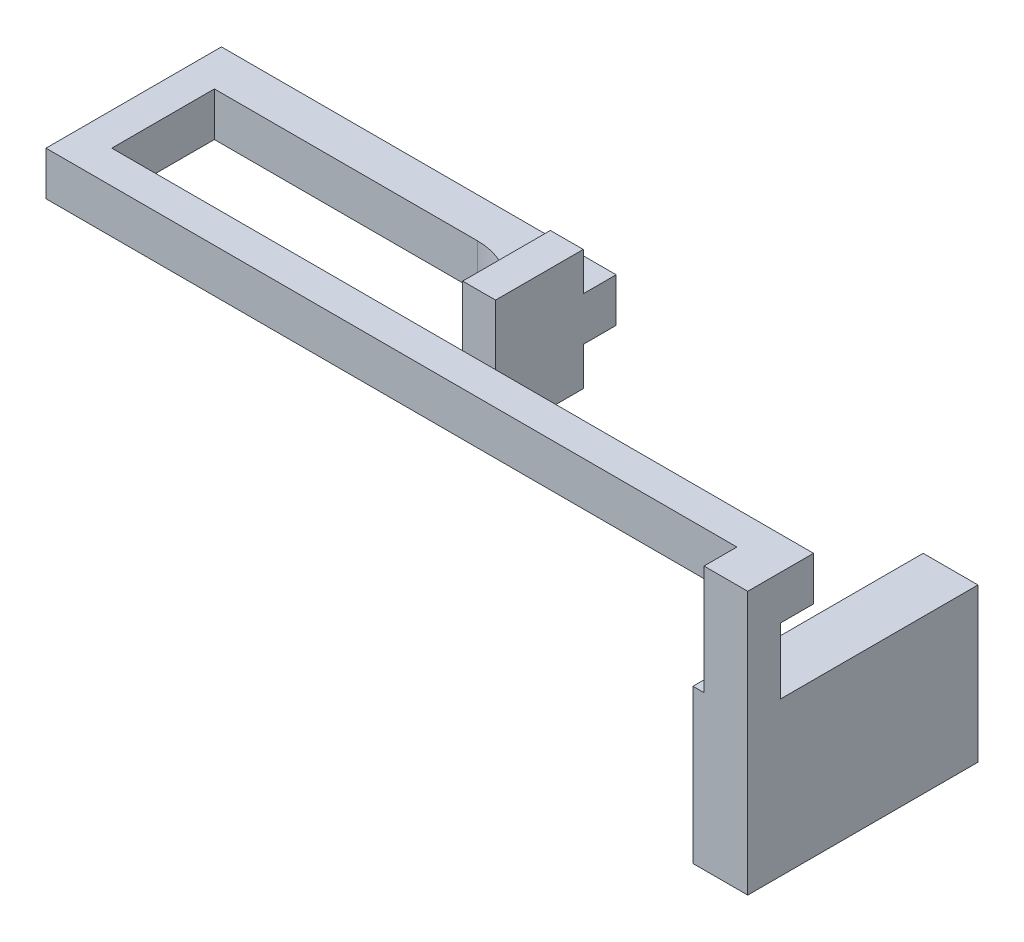
ISO-10303-21;
HEADER;
FILE_DESCRIPTION(('STEP AP214'),'2;1');
FILE_NAME('part.step','',(''),(''),'','','');
FILE_SCHEMA(('AUTOMOTIVE_DESIGN { 1 0 10303 214 1 1 1 1 }'));
ENDSEC;
DATA;
#1=APPLICATION_CONTEXT('core data for automotive mechanical design processes');
#2=APPLICATION_PROTOCOL_DEFINITION('international standard','automotive_design',2000,#1);
#3=PRODUCT_CONTEXT('',#1,'mechanical');
#4=PRODUCT('Part','Part','',(#3));
#5=PRODUCT_RELATED_PRODUCT_CATEGORY('part','',(#4));
#6=PRODUCT_DEFINITION_FORMATION('','',#4);
#7=PRODUCT_DEFINITION_CONTEXT('part definition',#1,'design');
#8=PRODUCT_DEFINITION('design','',#6,#7);
#9=PRODUCT_DEFINITION_SHAPE('','',#8);
#10=(LENGTH_UNIT() NAMED_UNIT(*) SI_UNIT(.MILLI.,.METRE.));
#11=(NAMED_UNIT(*) PLANE_ANGLE_UNIT() SI_UNIT($,.RADIAN.));
#12=(NAMED_UNIT(*) SI_UNIT($,.STERADIAN.) SOLID_ANGLE_UNIT());
#13=UNCERTAINTY_MEASURE_WITH_UNIT(LENGTH_MEASURE(1.E-05),#10,'distance_accuracy_value','');
#14=(GEOMETRIC_REPRESENTATION_CONTEXT(3) GLOBAL_UNCERTAINTY_ASSIGNED_CONTEXT((#13)) GLOBAL_UNIT_ASSIGNED_CONTEXT((#10,
#11,#12)) REPRESENTATION_CONTEXT('',''));
#15=CARTESIAN_POINT('',(0.,0.,0.));
#16=DIRECTION('',(0.,0.,1.));
#17=DIRECTION('',(1.,0.,0.));
#18=AXIS2_PLACEMENT_3D('',#15,#16,#17);
#19=CARTESIAN_POINT('',(-81.28,0.,0.));
#20=DIRECTION('',(1.,0.,0.));
#21=DIRECTION('',(0.,0.,-1.));
#22=AXIS2_PLACEMENT_3D('',#19,#20,#21);
#23=PLANE('',#22);
#24=DIRECTION('',(0.,0.,1.));
#25=VECTOR('',#24,1.);
#26=CARTESIAN_POINT('',(-81.28,0.,3.81));
#27=LINE('',#26,#25);
#28=CARTESIAN_POINT('',(-81.28,0.,-11.8836444934551));
#29=VERTEX_POINT('',#28);
#30=CARTESIAN_POINT('',(-81.28,0.,0.));
#31=VERTEX_POINT('',#30);
#32=EDGE_CURVE('E257',#29,#31,#27,.T.);
#33=ORIENTED_EDGE('',*,*,#32,.F.);
#34=DIRECTION('',(0.,-1.,0.));
#35=VECTOR('',#34,1.);
#36=CARTESIAN_POINT('',(-81.28,5.07999999999999,-11.8836444934551));
#37=LINE('',#36,#35);
#38=CARTESIAN_POINT('',(-81.28,5.07999999999999,-11.8836444934551));
#39=VERTEX_POINT('',#38);
#40=EDGE_CURVE('E241',#39,#29,#37,.T.);
#41=ORIENTED_EDGE('',*,*,#40,.F.);
#42=DIRECTION('',(0.,0.,-1.));
#43=VECTOR('',#42,1.);
#44=CARTESIAN_POINT('',(-81.28,5.07999999999999,3.81));
#45=LINE('',#44,#43);
#46=CARTESIAN_POINT('',(-81.28,5.07999999999999,0.));
#47=VERTEX_POINT('',#46);
#48=EDGE_CURVE('E252',#47,#39,#45,.T.);
#49=ORIENTED_EDGE('',*,*,#48,.F.);
#50=DIRECTION('',(0.,-1.,0.));
#51=VECTOR('',#50,1.);
#52=CARTESIAN_POINT('',(-81.28,0.,0.));
#53=LINE('',#52,#51);
#54=EDGE_CURVE('E328',#47,#31,#53,.T.);
#55=ORIENTED_EDGE('',*,*,#54,.T.);
#56=EDGE_LOOP('',(#33,#41,#49,#55));
#57=FACE_BOUND('',#56,.T.);
#58=ADVANCED_FACE('F34',(#57),#23,.T.);
#59=CARTESIAN_POINT('',(0.,0.,3.81));
#60=DIRECTION('',(0.,0.,1.));
#61=DIRECTION('',(1.,0.,0.));
#62=AXIS2_PLACEMENT_3D('',#59,#60,#61);
#63=PLANE('',#62);
#64=DIRECTION('',(1.,0.,0.));
#65=VECTOR('',#64,1.);
#66=CARTESIAN_POINT('',(0.,0.,3.81));
#67=LINE('',#66,#65);
#68=CARTESIAN_POINT('',(-85.09,0.,3.81));
#69=VERTEX_POINT('',#68);
#70=CARTESIAN_POINT('',(-5.06753308081898,0.,3.81));
#71=VERTEX_POINT('',#70);
#72=EDGE_CURVE('E320',#69,#71,#67,.T.);
#73=ORIENTED_EDGE('',*,*,#72,.T.);
#74=DIRECTION('',(0.,1.,0.));
#75=VECTOR('',#74,1.);
#76=CARTESIAN_POINT('',(-5.06753308081897,-25.4,3.81));
#77=LINE('',#76,#75);
#78=CARTESIAN_POINT('',(-5.06753308081897,5.08,3.81));
#79=VERTEX_POINT('',#78);
#80=EDGE_CURVE('E314',#71,#79,#77,.T.);
#81=ORIENTED_EDGE('',*,*,#80,.T.);
#82=DIRECTION('',(-1.,0.,0.));
#83=VECTOR('',#82,1.);
#84=CARTESIAN_POINT('',(0.,5.08,3.81));
#85=LINE('',#84,#83);
#86=CARTESIAN_POINT('',(-85.09,5.07999999999999,3.81));
#87=VERTEX_POINT('',#86);
#88=EDGE_CURVE('E316',#79,#87,#85,.T.);
#89=ORIENTED_EDGE('',*,*,#88,.T.);
#90=DIRECTION('',(0.,1.,0.));
#91=VECTOR('',#90,1.);
#92=CARTESIAN_POINT('',(-85.09,5.07999999999999,3.81));
#93=LINE('',#92,#91);
#94=EDGE_CURVE('E253',#69,#87,#93,.T.);
#95=ORIENTED_EDGE('',*,*,#94,.F.);
#96=EDGE_LOOP('',(#73,#81,#89,#95));
#97=FACE_BOUND('',#96,.T.);
#98=ADVANCED_FACE('F373',(#97),#63,.T.);
#99=CARTESIAN_POINT('',(0.,0.,3.81));
#100=DIRECTION('',(-1.,0.,0.));
#101=DIRECTION('',(0.,0.,1.));
#102=AXIS2_PLACEMENT_3D('',#99,#100,#101);
#103=PLANE('',#102);
#104=DIRECTION('',(0.,0.,-1.));
#105=VECTOR('',#104,1.);
#106=CARTESIAN_POINT('',(0.,5.08,3.81));
#107=LINE('',#106,#105);
#108=CARTESIAN_POINT('',(0.,5.08,7.62));
#109=VERTEX_POINT('',#108);
#110=CARTESIAN_POINT('',(0.,5.08,0.));
#111=VERTEX_POINT('',#110);
#112=EDGE_CURVE('E334',#109,#111,#107,.T.);
#113=ORIENTED_EDGE('',*,*,#112,.F.);
#114=DIRECTION('',(0.,1.,0.));
#115=VECTOR('',#114,1.);
#116=CARTESIAN_POINT('',(0.,-25.4,7.62));
#117=LINE('',#116,#115);
#118=CARTESIAN_POINT('',(0.,-25.4,7.62));
#119=VERTEX_POINT('',#118);
#120=EDGE_CURVE('E307',#119,#109,#117,.T.);
#121=ORIENTED_EDGE('',*,*,#120,.F.);
#122=DIRECTION('',(0.,0.,-1.));
#123=VECTOR('',#122,1.);
#124=CARTESIAN_POINT('',(0.,-25.4,3.81));
#125=LINE('',#124,#123);
#126=CARTESIAN_POINT('',(0.,-25.4,-19.05));
#127=VERTEX_POINT('',#126);
#128=EDGE_CURVE('E296',#119,#127,#125,.T.);
#129=ORIENTED_EDGE('',*,*,#128,.T.);
#130=DIRECTION('',(0.,1.,0.));
#131=VECTOR('',#130,1.);
#132=CARTESIAN_POINT('',(0.,-25.4,-19.05));
#133=LINE('',#132,#131);
#134=CARTESIAN_POINT('',(0.,-7.62,-19.05));
#135=VERTEX_POINT('',#134);
#136=EDGE_CURVE('E269',#127,#135,#133,.T.);
#137=ORIENTED_EDGE('',*,*,#136,.T.);
#138=DIRECTION('',(0.,0.,1.));
#139=VECTOR('',#138,1.);
#140=CARTESIAN_POINT('',(0.,-7.62,7.62));
#141=LINE('',#140,#139);
#142=CARTESIAN_POINT('',(0.,-7.62000000000001,3.81));
#143=VERTEX_POINT('',#142);
#144=EDGE_CURVE('E274',#135,#143,#141,.T.);
#145=ORIENTED_EDGE('',*,*,#144,.T.);
#146=DIRECTION('',(0.,1.,0.));
#147=VECTOR('',#146,1.);
#148=CARTESIAN_POINT('',(0.,-25.4,3.81));
#149=LINE('',#148,#147);
#150=CARTESIAN_POINT('',(0.,0.,3.81));
#151=VERTEX_POINT('',#150);
#152=EDGE_CURVE('E302',#143,#151,#149,.T.);
#153=ORIENTED_EDGE('',*,*,#152,.T.);
#154=DIRECTION('',(0.,0.,-1.));
#155=VECTOR('',#154,1.);
#156=CARTESIAN_POINT('',(0.,0.,3.81));
#157=LINE('',#156,#155);
#158=CARTESIAN_POINT('',(0.,0.,0.));
#159=VERTEX_POINT('',#158);
#160=EDGE_CURVE('E323',#151,#159,#157,.T.);
#161=ORIENTED_EDGE('',*,*,#160,.T.);
#162=DIRECTION('',(0.,1.,0.));
#163=VECTOR('',#162,1.);
#164=CARTESIAN_POINT('',(0.,0.,0.));
#165=LINE('',#164,#163);
#166=EDGE_CURVE('E309',#159,#111,#165,.T.);
#167=ORIENTED_EDGE('',*,*,#166,.T.);
#168=EDGE_LOOP('',(#113,#121,#129,#137,#145,#153,#161,#167));
#169=FACE_BOUND('',#168,.T.);
#170=ADVANCED_FACE('F365',(#169),#103,.F.);
#171=CARTESIAN_POINT('',(0.,5.08,3.81));
#172=DIRECTION('',(0.,-1.,0.));
#173=DIRECTION('',(1.,0.,0.));
#174=AXIS2_PLACEMENT_3D('',#171,#172,#173);
#175=PLANE('',#174);
#176=DIRECTION('',(0.,0.,1.));
#177=VECTOR('',#176,1.);
#178=CARTESIAN_POINT('',(-43.18,5.07999999999999,-16.51));
#179=LINE('',#178,#177);
#180=CARTESIAN_POINT('',(-43.18,5.08,-12.7));
#181=VERTEX_POINT('',#180);
#182=CARTESIAN_POINT('',(-43.18,5.08,-4.26364449345514));
#183=VERTEX_POINT('',#182);
#184=EDGE_CURVE('E242',#181,#183,#179,.T.);
#185=ORIENTED_EDGE('',*,*,#184,.F.);
#186=DIRECTION('',(1.,0.,0.));
#187=VECTOR('',#186,1.);
#188=CARTESIAN_POINT('',(-85.09,5.08,-12.7));
#189=LINE('',#188,#187);
#190=CARTESIAN_POINT('',(-39.37,5.08,-12.7));
#191=VERTEX_POINT('',#190);
#192=EDGE_CURVE('E199',#181,#191,#189,.T.);
#193=ORIENTED_EDGE('',*,*,#192,.T.);
#194=DIRECTION('',(0.,0.,-1.));
#195=VECTOR('',#194,1.);
#196=CARTESIAN_POINT('',(-39.37,5.08,-16.51));
#197=LINE('',#196,#195);
#198=CARTESIAN_POINT('',(-39.37,5.08,-16.51));
#199=VERTEX_POINT('',#198);
#200=EDGE_CURVE('E212',#191,#199,#197,.T.);
#201=ORIENTED_EDGE('',*,*,#200,.T.);
#202=DIRECTION('',(1.,0.,0.));
#203=VECTOR('',#202,1.);
#204=CARTESIAN_POINT('',(-85.09,5.07999999999999,-16.51));
#205=LINE('',#204,#203);
#206=CARTESIAN_POINT('',(-85.09,5.07999999999999,-16.51));
#207=VERTEX_POINT('',#206);
#208=EDGE_CURVE('E267',#207,#199,#205,.T.);
#209=ORIENTED_EDGE('',*,*,#208,.F.);
#210=DIRECTION('',(0.,0.,-1.));
#211=VECTOR('',#210,1.);
#212=CARTESIAN_POINT('',(-85.09,5.07999999999999,3.81));
#213=LINE('',#212,#211);
#214=EDGE_CURVE('E256',#87,#207,#213,.T.);
#215=ORIENTED_EDGE('',*,*,#214,.F.);
#216=ORIENTED_EDGE('',*,*,#88,.F.);
#217=DIRECTION('',(0.,0.,1.));
#218=VECTOR('',#217,1.);
#219=CARTESIAN_POINT('',(-5.06753308081898,5.08,3.81));
#220=LINE('',#219,#218);
#221=CARTESIAN_POINT('',(-5.06753308081898,5.08,7.62));
#222=VERTEX_POINT('',#221);
#223=EDGE_CURVE('E295',#79,#222,#220,.T.);
#224=ORIENTED_EDGE('',*,*,#223,.T.);
#225=DIRECTION('',(1.,0.,0.));
#226=VECTOR('',#225,1.);
#227=CARTESIAN_POINT('',(0.,5.08,7.62));
#228=LINE('',#227,#226);
#229=EDGE_CURVE('E299',#222,#109,#228,.T.);
#230=ORIENTED_EDGE('',*,*,#229,.T.);
#231=ORIENTED_EDGE('',*,*,#112,.T.);
#232=DIRECTION('',(-1.,0.,0.));
#233=VECTOR('',#232,1.);
#234=CARTESIAN_POINT('',(0.,5.08,0.));
#235=LINE('',#234,#233);
#236=EDGE_CURVE('E326',#111,#47,#235,.T.);
#237=ORIENTED_EDGE('',*,*,#236,.T.);
#238=ORIENTED_EDGE('',*,*,#48,.T.);
#239=DIRECTION('',(-1.,0.,0.));
#240=VECTOR('',#239,1.);
#241=CARTESIAN_POINT('',(-43.18,5.07999999999999,-11.8836444934551));
#242=LINE('',#241,#240);
#243=CARTESIAN_POINT('',(-50.8,5.07999999999999,-11.8836444934551));
#244=VERTEX_POINT('',#243);
#245=EDGE_CURVE('E250',#244,#39,#242,.T.);
#246=ORIENTED_EDGE('',*,*,#245,.F.);
#247=CARTESIAN_POINT('',(-50.8,5.07999999999999,-4.26364449345514));
#248=DIRECTION('',(0.,-1.,0.));
#249=DIRECTION('',(1.,0.,0.));
#250=AXIS2_PLACEMENT_3D('',#247,#248,#249);
#251=CIRCLE('',#250,7.62);
#252=EDGE_CURVE('E11',#244,#183,#251,.T.);
#253=ORIENTED_EDGE('',*,*,#252,.T.);
#254=EDGE_LOOP('',(#185,#193,#201,#209,#215,#216,#224,#230,#231,#237,#238,#246,#253));
#255=FACE_BOUND('',#254,.T.);
#256=ADVANCED_FACE('F351',(#255),#175,.F.);
#257=CARTESIAN_POINT('',(0.,0.,3.81));
#258=DIRECTION('',(0.,1.,0.));
#259=DIRECTION('',(-1.,0.,0.));
#260=AXIS2_PLACEMENT_3D('',#257,#258,#259);
#261=PLANE('',#260);
#262=ORIENTED_EDGE('',*,*,#72,.F.);
#263=DIRECTION('',(0.,0.,1.));
#264=VECTOR('',#263,1.);
#265=CARTESIAN_POINT('',(-85.09,0.,3.81));
#266=LINE('',#265,#264);
#267=CARTESIAN_POINT('',(-85.09,0.,-16.51));
#268=VERTEX_POINT('',#267);
#269=EDGE_CURVE('E261',#268,#69,#266,.T.);
#270=ORIENTED_EDGE('',*,*,#269,.F.);
#271=DIRECTION('',(1.,0.,0.));
#272=VECTOR('',#271,1.);
#273=CARTESIAN_POINT('',(-85.09,0.,-16.51));
#274=LINE('',#273,#272);
#275=CARTESIAN_POINT('',(-39.37,0.,-16.51));
#276=VERTEX_POINT('',#275);
#277=EDGE_CURVE('E195',#268,#276,#274,.T.);
#278=ORIENTED_EDGE('',*,*,#277,.T.);
#279=DIRECTION('',(0.,0.,1.));
#280=VECTOR('',#279,1.);
#281=CARTESIAN_POINT('',(-39.37,0.,-16.51));
#282=LINE('',#281,#280);
#283=CARTESIAN_POINT('',(-39.37,0.,-12.7));
#284=VERTEX_POINT('',#283);
#285=EDGE_CURVE('E190',#276,#284,#282,.T.);
#286=ORIENTED_EDGE('',*,*,#285,.T.);
#287=DIRECTION('',(1.,0.,0.));
#288=VECTOR('',#287,1.);
#289=CARTESIAN_POINT('',(-85.09,0.,-12.7));
#290=LINE('',#289,#288);
#291=CARTESIAN_POINT('',(-43.18,0.,-12.7));
#292=VERTEX_POINT('',#291);
#293=EDGE_CURVE('E178',#292,#284,#290,.T.);
#294=ORIENTED_EDGE('',*,*,#293,.F.);
#295=DIRECTION('',(0.,0.,-1.));
#296=VECTOR('',#295,1.);
#297=CARTESIAN_POINT('',(-43.18,0.,-16.51));
#298=LINE('',#297,#296);
#299=CARTESIAN_POINT('',(-43.18,0.,-4.26364449345514));
#300=VERTEX_POINT('',#299);
#301=EDGE_CURVE('E244',#300,#292,#298,.T.);
#302=ORIENTED_EDGE('',*,*,#301,.F.);
#303=CARTESIAN_POINT('',(-50.8,0.,-4.26364449345514));
#304=DIRECTION('',(0.,1.,0.));
#305=DIRECTION('',(-1.,0.,0.));
#306=AXIS2_PLACEMENT_3D('',#303,#304,#305);
#307=CIRCLE('',#306,7.62);
#308=CARTESIAN_POINT('',(-50.8,0.,-11.8836444934551));
#309=VERTEX_POINT('',#308);
#310=EDGE_CURVE('E42',#300,#309,#307,.T.);
#311=ORIENTED_EDGE('',*,*,#310,.T.);
#312=DIRECTION('',(-1.,0.,0.));
#313=VECTOR('',#312,1.);
#314=CARTESIAN_POINT('',(-43.18,0.,-11.8836444934551));
#315=LINE('',#314,#313);
#316=EDGE_CURVE('E246',#309,#29,#315,.T.);
#317=ORIENTED_EDGE('',*,*,#316,.T.);
#318=ORIENTED_EDGE('',*,*,#32,.T.);
#319=DIRECTION('',(1.,0.,0.));
#320=VECTOR('',#319,1.);
#321=CARTESIAN_POINT('',(0.,0.,0.));
#322=LINE('',#321,#320);
#323=EDGE_CURVE('E319',#31,#159,#322,.T.);
#324=ORIENTED_EDGE('',*,*,#323,.T.);
#325=ORIENTED_EDGE('',*,*,#160,.F.);
#326=EDGE_CURVE('E318',#71,#151,#67,.T.);
#327=ORIENTED_EDGE('',*,*,#326,.F.);
#328=EDGE_LOOP('',(#262,#270,#278,#286,#294,#302,#311,#317,#318,#324,#325,#327));
#329=FACE_BOUND('',#328,.T.);
#330=ADVANCED_FACE('F192',(#329),#261,.F.);
#331=CARTESIAN_POINT('',(0.,0.,0.));
#332=DIRECTION('',(0.,0.,1.));
#333=DIRECTION('',(1.,0.,0.));
#334=AXIS2_PLACEMENT_3D('',#331,#332,#333);
#335=PLANE('',#334);
#336=ORIENTED_EDGE('',*,*,#166,.F.);
#337=ORIENTED_EDGE('',*,*,#323,.F.);
#338=ORIENTED_EDGE('',*,*,#54,.F.);
#339=ORIENTED_EDGE('',*,*,#236,.F.);
#340=EDGE_LOOP('',(#336,#337,#338,#339));
#341=FACE_BOUND('',#340,.T.);
#342=ADVANCED_FACE('F362',(#341),#335,.F.);
#343=CARTESIAN_POINT('',(0.,-25.4,7.62));
#344=DIRECTION('',(0.,0.,1.));
#345=DIRECTION('',(1.,0.,0.));
#346=AXIS2_PLACEMENT_3D('',#343,#344,#345);
#347=PLANE('',#346);
#348=DIRECTION('',(0.,1.,0.));
#349=VECTOR('',#348,1.);
#350=CARTESIAN_POINT('',(-5.06753308081897,-25.4,7.62));
#351=LINE('',#350,#349);
#352=CARTESIAN_POINT('',(-5.06753308081897,-7.62,7.62));
#353=VERTEX_POINT('',#352);
#354=EDGE_CURVE('E310',#353,#222,#351,.T.);
#355=ORIENTED_EDGE('',*,*,#354,.F.);
#356=DIRECTION('',(1.,0.,0.));
#357=VECTOR('',#356,1.);
#358=CARTESIAN_POINT('',(-6.35,-7.62,7.62));
#359=LINE('',#358,#357);
#360=CARTESIAN_POINT('',(-6.35,-7.62,7.62));
#361=VERTEX_POINT('',#360);
#362=EDGE_CURVE('E287',#361,#353,#359,.T.);
#363=ORIENTED_EDGE('',*,*,#362,.F.);
#364=DIRECTION('',(0.,-1.,0.));
#365=VECTOR('',#364,1.);
#366=CARTESIAN_POINT('',(-6.35,-25.4,7.62));
#367=LINE('',#366,#365);
#368=CARTESIAN_POINT('',(-6.35,-25.4,7.62));
#369=VERTEX_POINT('',#368);
#370=EDGE_CURVE('E270',#361,#369,#367,.T.);
#371=ORIENTED_EDGE('',*,*,#370,.T.);
#372=DIRECTION('',(1.,0.,0.));
#373=VECTOR('',#372,1.);
#374=CARTESIAN_POINT('',(0.,-25.4,7.62));
#375=LINE('',#374,#373);
#376=EDGE_CURVE('E298',#369,#119,#375,.T.);
#377=ORIENTED_EDGE('',*,*,#376,.T.);
#378=ORIENTED_EDGE('',*,*,#120,.T.);
#379=ORIENTED_EDGE('',*,*,#229,.F.);
#380=EDGE_LOOP('',(#355,#363,#371,#377,#378,#379));
#381=FACE_BOUND('',#380,.T.);
#382=ADVANCED_FACE('F436',(#381),#347,.T.);
#383=CARTESIAN_POINT('',(-5.06753308081897,-25.4,3.81));
#384=DIRECTION('',(-1.,0.,0.));
#385=DIRECTION('',(0.,-1.,0.));
#386=AXIS2_PLACEMENT_3D('',#383,#384,#385);
#387=PLANE('',#386);
#388=DIRECTION('',(0.,0.,-1.));
#389=VECTOR('',#388,1.);
#390=CARTESIAN_POINT('',(-5.06753308081897,-7.62,3.81));
#391=LINE('',#390,#389);
#392=CARTESIAN_POINT('',(-5.06753308081898,-7.62,3.81));
#393=VERTEX_POINT('',#392);
#394=EDGE_CURVE('E289',#353,#393,#391,.T.);
#395=ORIENTED_EDGE('',*,*,#394,.F.);
#396=ORIENTED_EDGE('',*,*,#354,.T.);
#397=ORIENTED_EDGE('',*,*,#223,.F.);
#398=ORIENTED_EDGE('',*,*,#80,.F.);
#399=EDGE_CURVE('E312',#393,#71,#77,.T.);
#400=ORIENTED_EDGE('',*,*,#399,.F.);
#401=EDGE_LOOP('',(#395,#396,#397,#398,#400));
#402=FACE_BOUND('',#401,.T.);
#403=ADVANCED_FACE('F439',(#402),#387,.T.);
#404=CARTESIAN_POINT('',(0.,-25.4,3.81));
#405=DIRECTION('',(0.,0.,-1.));
#406=DIRECTION('',(-1.,0.,0.));
#407=AXIS2_PLACEMENT_3D('',#404,#405,#406);
#408=PLANE('',#407);
#409=DIRECTION('',(1.,0.,0.));
#410=VECTOR('',#409,1.);
#411=CARTESIAN_POINT('',(0.,-7.62,3.81));
#412=LINE('',#411,#410);
#413=EDGE_CURVE('E337',#393,#143,#412,.T.);
#414=ORIENTED_EDGE('',*,*,#413,.F.);
#415=ORIENTED_EDGE('',*,*,#399,.T.);
#416=ORIENTED_EDGE('',*,*,#326,.T.);
#417=ORIENTED_EDGE('',*,*,#152,.F.);
#418=EDGE_LOOP('',(#414,#415,#416,#417));
#419=FACE_BOUND('',#418,.T.);
#420=ADVANCED_FACE('F434',(#419),#408,.T.);
#421=CARTESIAN_POINT('',(0.,-25.4,0.));
#422=DIRECTION('',(0.,-1.,0.));
#423=DIRECTION('',(1.,0.,0.));
#424=AXIS2_PLACEMENT_3D('',#421,#422,#423);
#425=PLANE('',#424);
#426=ORIENTED_EDGE('',*,*,#376,.F.);
#427=DIRECTION('',(0.,0.,-1.));
#428=VECTOR('',#427,1.);
#429=CARTESIAN_POINT('',(-6.35,-25.4,7.62));
#430=LINE('',#429,#428);
#431=CARTESIAN_POINT('',(-6.35,-25.4,-19.05));
#432=VERTEX_POINT('',#431);
#433=EDGE_CURVE('E273',#369,#432,#430,.T.);
#434=ORIENTED_EDGE('',*,*,#433,.T.);
#435=DIRECTION('',(1.,0.,0.));
#436=VECTOR('',#435,1.);
#437=CARTESIAN_POINT('',(-6.35,-25.4,-19.05));
#438=LINE('',#437,#436);
#439=EDGE_CURVE('E283',#432,#127,#438,.T.);
#440=ORIENTED_EDGE('',*,*,#439,.T.);
#441=ORIENTED_EDGE('',*,*,#128,.F.);
#442=EDGE_LOOP('',(#426,#434,#440,#441));
#443=FACE_BOUND('',#442,.T.);
#444=ADVANCED_FACE('F427',(#443),#425,.T.);
#445=CARTESIAN_POINT('',(-6.35,-7.62,7.62));
#446=DIRECTION('',(0.,1.,0.));
#447=DIRECTION('',(0.,0.,1.));
#448=AXIS2_PLACEMENT_3D('',#445,#446,#447);
#449=PLANE('',#448);
#450=ORIENTED_EDGE('',*,*,#362,.T.);
#451=ORIENTED_EDGE('',*,*,#394,.T.);
#452=ORIENTED_EDGE('',*,*,#413,.T.);
#453=ORIENTED_EDGE('',*,*,#144,.F.);
#454=DIRECTION('',(1.,0.,0.));
#455=VECTOR('',#454,1.);
#456=CARTESIAN_POINT('',(-6.35,-7.62,-19.05));
#457=LINE('',#456,#455);
#458=CARTESIAN_POINT('',(-6.35,-7.62,-19.05));
#459=VERTEX_POINT('',#458);
#460=EDGE_CURVE('E290',#459,#135,#457,.T.);
#461=ORIENTED_EDGE('',*,*,#460,.F.);
#462=DIRECTION('',(0.,0.,1.));
#463=VECTOR('',#462,1.);
#464=CARTESIAN_POINT('',(-6.35,-7.62,7.62));
#465=LINE('',#464,#463);
#466=EDGE_CURVE('E280',#459,#361,#465,.T.);
#467=ORIENTED_EDGE('',*,*,#466,.T.);
#468=EDGE_LOOP('',(#450,#451,#452,#453,#461,#467));
#469=FACE_BOUND('',#468,.T.);
#470=ADVANCED_FACE('F424',(#469),#449,.T.);
#471=CARTESIAN_POINT('',(-6.35,-25.4,-19.05));
#472=DIRECTION('',(0.,0.,-1.));
#473=DIRECTION('',(-1.,0.,0.));
#474=AXIS2_PLACEMENT_3D('',#471,#472,#473);
#475=PLANE('',#474);
#476=ORIENTED_EDGE('',*,*,#136,.F.);
#477=ORIENTED_EDGE('',*,*,#439,.F.);
#478=DIRECTION('',(0.,1.,0.));
#479=VECTOR('',#478,1.);
#480=CARTESIAN_POINT('',(-6.35,-25.4,-19.05));
#481=LINE('',#480,#479);
#482=EDGE_CURVE('E277',#432,#459,#481,.T.);
#483=ORIENTED_EDGE('',*,*,#482,.T.);
#484=ORIENTED_EDGE('',*,*,#460,.T.);
#485=EDGE_LOOP('',(#476,#477,#483,#484));
#486=FACE_BOUND('',#485,.T.);
#487=ADVANCED_FACE('F422',(#486),#475,.T.);
#488=CARTESIAN_POINT('',(-6.35,0.,0.));
#489=DIRECTION('',(-1.,0.,0.));
#490=DIRECTION('',(0.,0.,1.));
#491=AXIS2_PLACEMENT_3D('',#488,#489,#490);
#492=PLANE('',#491);
#493=ORIENTED_EDGE('',*,*,#370,.F.);
#494=ORIENTED_EDGE('',*,*,#466,.F.);
#495=ORIENTED_EDGE('',*,*,#482,.F.);
#496=ORIENTED_EDGE('',*,*,#433,.F.);
#497=EDGE_LOOP('',(#493,#494,#495,#496));
#498=FACE_BOUND('',#497,.T.);
#499=ADVANCED_FACE('F419',(#498),#492,.T.);
#500=CARTESIAN_POINT('',(-85.09,5.07999999999999,-16.51));
#501=DIRECTION('',(0.,0.,1.));
#502=DIRECTION('',(1.,0.,0.));
#503=AXIS2_PLACEMENT_3D('',#500,#501,#502);
#504=PLANE('',#503);
#505=DIRECTION('',(0.,1.,0.));
#506=VECTOR('',#505,1.);
#507=CARTESIAN_POINT('',(-39.37,-4.44500000000001,-16.51));
#508=LINE('',#507,#506);
#509=EDGE_CURVE('E225',#276,#199,#508,.T.);
#510=ORIENTED_EDGE('',*,*,#509,.F.);
#511=ORIENTED_EDGE('',*,*,#277,.F.);
#512=DIRECTION('',(0.,-1.,0.));
#513=VECTOR('',#512,1.);
#514=CARTESIAN_POINT('',(-85.09,5.07999999999999,-16.51));
#515=LINE('',#514,#513);
#516=EDGE_CURVE('E259',#207,#268,#515,.T.);
#517=ORIENTED_EDGE('',*,*,#516,.F.);
#518=ORIENTED_EDGE('',*,*,#208,.T.);
#519=EDGE_LOOP('',(#510,#511,#517,#518));
#520=FACE_BOUND('',#519,.T.);
#521=ADVANCED_FACE('F382',(#520),#504,.F.);
#522=CARTESIAN_POINT('',(-85.09,0.,0.));
#523=DIRECTION('',(1.,0.,0.));
#524=DIRECTION('',(0.,0.,-1.));
#525=AXIS2_PLACEMENT_3D('',#522,#523,#524);
#526=PLANE('',#525);
#527=ORIENTED_EDGE('',*,*,#94,.T.);
#528=ORIENTED_EDGE('',*,*,#214,.T.);
#529=ORIENTED_EDGE('',*,*,#516,.T.);
#530=ORIENTED_EDGE('',*,*,#269,.T.);
#531=EDGE_LOOP('',(#527,#528,#529,#530));
#532=FACE_BOUND('',#531,.T.);
#533=ADVANCED_FACE('F378',(#532),#526,.F.);
#534=CARTESIAN_POINT('',(-43.18,5.07999999999999,-11.8836444934551));
#535=DIRECTION('',(0.,0.,-1.));
#536=DIRECTION('',(-1.,0.,0.));
#537=AXIS2_PLACEMENT_3D('',#534,#535,#536);
#538=PLANE('',#537);
#539=ORIENTED_EDGE('',*,*,#316,.F.);
#540=DIRECTION('',(0.,-1.,0.));
#541=VECTOR('',#540,1.);
#542=CARTESIAN_POINT('',(-50.8,5.07999999999999,-11.8836444934551));
#543=LINE('',#542,#541);
#544=EDGE_CURVE('E49',#309,#244,#543,.F.);
#545=ORIENTED_EDGE('',*,*,#544,.T.);
#546=ORIENTED_EDGE('',*,*,#245,.T.);
#547=ORIENTED_EDGE('',*,*,#40,.T.);
#548=EDGE_LOOP('',(#539,#545,#546,#547));
#549=FACE_BOUND('',#548,.T.);
#550=ADVANCED_FACE('F354',(#549),#538,.F.);
#551=CARTESIAN_POINT('',(-43.18,0.,0.));
#552=DIRECTION('',(-1.,0.,0.));
#553=DIRECTION('',(0.,0.,1.));
#554=AXIS2_PLACEMENT_3D('',#551,#552,#553);
#555=PLANE('',#554);
#556=DIRECTION('',(0.,-1.,0.));
#557=VECTOR('',#556,1.);
#558=CARTESIAN_POINT('',(-43.18,0.,-4.26364449345514));
#559=LINE('',#558,#557);
#560=EDGE_CURVE('E340',#183,#300,#559,.T.);
#561=ORIENTED_EDGE('',*,*,#560,.T.);
#562=ORIENTED_EDGE('',*,*,#301,.T.);
#563=DIRECTION('',(0.,1.,0.));
#564=VECTOR('',#563,1.);
#565=CARTESIAN_POINT('',(-43.18,0.,-12.7));
#566=LINE('',#565,#564);
#567=CARTESIAN_POINT('',(-43.18,-4.44500000000001,-12.7));
#568=VERTEX_POINT('',#567);
#569=EDGE_CURVE('E185',#568,#292,#566,.T.);
#570=ORIENTED_EDGE('',*,*,#569,.F.);
#571=DIRECTION('',(0.,0.,-1.));
#572=VECTOR('',#571,1.);
#573=CARTESIAN_POINT('',(-43.18,-4.44500000000001,-2.54));
#574=LINE('',#573,#572);
#575=CARTESIAN_POINT('',(-43.18,-4.44500000000001,-2.54));
#576=VERTEX_POINT('',#575);
#577=EDGE_CURVE('E232',#576,#568,#574,.T.);
#578=ORIENTED_EDGE('',*,*,#577,.F.);
#579=DIRECTION('',(0.,-1.,0.));
#580=VECTOR('',#579,1.);
#581=CARTESIAN_POINT('',(-43.18,-4.44500000000001,-2.54));
#582=LINE('',#581,#580);
#583=CARTESIAN_POINT('',(-43.18,9.52499999999999,-2.54));
#584=VERTEX_POINT('',#583);
#585=EDGE_CURVE('E220',#584,#576,#582,.T.);
#586=ORIENTED_EDGE('',*,*,#585,.F.);
#587=DIRECTION('',(0.,0.,1.));
#588=VECTOR('',#587,1.);
#589=CARTESIAN_POINT('',(-43.18,9.52499999999999,-2.54));
#590=LINE('',#589,#588);
#591=CARTESIAN_POINT('',(-43.18,9.52499999999999,-12.7));
#592=VERTEX_POINT('',#591);
#593=EDGE_CURVE('E223',#592,#584,#590,.T.);
#594=ORIENTED_EDGE('',*,*,#593,.F.);
#595=DIRECTION('',(0.,1.,0.));
#596=VECTOR('',#595,1.);
#597=CARTESIAN_POINT('',(-43.18,0.,-12.7));
#598=LINE('',#597,#596);
#599=EDGE_CURVE('E207',#181,#592,#598,.T.);
#600=ORIENTED_EDGE('',*,*,#599,.F.);
#601=ORIENTED_EDGE('',*,*,#184,.T.);
#602=EDGE_LOOP('',(#561,#562,#570,#578,#586,#594,#600,#601));
#603=FACE_BOUND('',#602,.T.);
#604=ADVANCED_FACE('F345',(#603),#555,.T.);
#605=CARTESIAN_POINT('',(-39.37,-4.44500000000001,-2.54));
#606=DIRECTION('',(0.,0.,-1.));
#607=DIRECTION('',(0.,1.,0.));
#608=AXIS2_PLACEMENT_3D('',#605,#606,#607);
#609=PLANE('',#608);
#610=ORIENTED_EDGE('',*,*,#585,.T.);
#611=DIRECTION('',(-1.,0.,0.));
#612=VECTOR('',#611,1.);
#613=CARTESIAN_POINT('',(-39.37,-4.44500000000001,-2.54));
#614=LINE('',#613,#612);
#615=CARTESIAN_POINT('',(-39.37,-4.44500000000001,-2.54));
#616=VERTEX_POINT('',#615);
#617=EDGE_CURVE('E238',#616,#576,#614,.T.);
#618=ORIENTED_EDGE('',*,*,#617,.F.);
#619=DIRECTION('',(0.,-1.,0.));
#620=VECTOR('',#619,1.);
#621=CARTESIAN_POINT('',(-39.37,-4.44500000000001,-2.54));
#622=LINE('',#621,#620);
#623=CARTESIAN_POINT('',(-39.37,9.52499999999999,-2.54));
#624=VERTEX_POINT('',#623);
#625=EDGE_CURVE('E221',#624,#616,#622,.T.);
#626=ORIENTED_EDGE('',*,*,#625,.F.);
#627=DIRECTION('',(-1.,0.,0.));
#628=VECTOR('',#627,1.);
#629=CARTESIAN_POINT('',(-39.37,9.52499999999999,-2.54));
#630=LINE('',#629,#628);
#631=EDGE_CURVE('E229',#624,#584,#630,.T.);
#632=ORIENTED_EDGE('',*,*,#631,.T.);
#633=EDGE_LOOP('',(#610,#618,#626,#632));
#634=FACE_BOUND('',#633,.T.);
#635=ADVANCED_FACE('F396',(#634),#609,.F.);
#636=CARTESIAN_POINT('',(-39.37,-4.44500000000001,-2.54));
#637=DIRECTION('',(0.,1.,0.));
#638=DIRECTION('',(0.,0.,1.));
#639=AXIS2_PLACEMENT_3D('',#636,#637,#638);
#640=PLANE('',#639);
#641=ORIENTED_EDGE('',*,*,#577,.T.);
#642=DIRECTION('',(1.,0.,0.));
#643=VECTOR('',#642,1.);
#644=CARTESIAN_POINT('',(-85.09,-4.44500000000001,-12.7));
#645=LINE('',#644,#643);
#646=CARTESIAN_POINT('',(-39.37,-4.44500000000001,-12.7));
#647=VERTEX_POINT('',#646);
#648=EDGE_CURVE('E187',#568,#647,#645,.T.);
#649=ORIENTED_EDGE('',*,*,#648,.T.);
#650=DIRECTION('',(0.,0.,-1.));
#651=VECTOR('',#650,1.);
#652=CARTESIAN_POINT('',(-39.37,-4.44500000000001,-2.54));
#653=LINE('',#652,#651);
#654=EDGE_CURVE('E204',#616,#647,#653,.T.);
#655=ORIENTED_EDGE('',*,*,#654,.F.);
#656=ORIENTED_EDGE('',*,*,#617,.T.);
#657=EDGE_LOOP('',(#641,#649,#655,#656));
#658=FACE_BOUND('',#657,.T.);
#659=ADVANCED_FACE('F399',(#658),#640,.F.);
#660=CARTESIAN_POINT('',(-39.37,9.52499999999999,-2.54));
#661=DIRECTION('',(0.,-1.,0.));
#662=DIRECTION('',(0.,0.,-1.));
#663=AXIS2_PLACEMENT_3D('',#660,#661,#662);
#664=PLANE('',#663);
#665=DIRECTION('',(0.,0.,1.));
#666=VECTOR('',#665,1.);
#667=CARTESIAN_POINT('',(-39.37,9.52499999999999,-2.54));
#668=LINE('',#667,#666);
#669=CARTESIAN_POINT('',(-39.37,9.52499999999999,-12.7));
#670=VERTEX_POINT('',#669);
#671=EDGE_CURVE('E227',#670,#624,#668,.T.);
#672=ORIENTED_EDGE('',*,*,#671,.F.);
#673=DIRECTION('',(1.,0.,0.));
#674=VECTOR('',#673,1.);
#675=CARTESIAN_POINT('',(-85.09,9.52499999999999,-12.7));
#676=LINE('',#675,#674);
#677=EDGE_CURVE('E215',#592,#670,#676,.T.);
#678=ORIENTED_EDGE('',*,*,#677,.F.);
#679=ORIENTED_EDGE('',*,*,#593,.T.);
#680=ORIENTED_EDGE('',*,*,#631,.F.);
#681=EDGE_LOOP('',(#672,#678,#679,#680));
#682=FACE_BOUND('',#681,.T.);
#683=ADVANCED_FACE('F391',(#682),#664,.F.);
#684=CARTESIAN_POINT('',(-39.37,0.,0.));
#685=DIRECTION('',(-1.,0.,0.));
#686=DIRECTION('',(0.,0.,1.));
#687=AXIS2_PLACEMENT_3D('',#684,#685,#686);
#688=PLANE('',#687);
#689=ORIENTED_EDGE('',*,*,#654,.T.);
#690=DIRECTION('',(0.,-1.,0.));
#691=VECTOR('',#690,1.);
#692=CARTESIAN_POINT('',(-39.37,-4.44500000000001,-12.7));
#693=LINE('',#692,#691);
#694=EDGE_CURVE('E182',#284,#647,#693,.T.);
#695=ORIENTED_EDGE('',*,*,#694,.F.);
#696=ORIENTED_EDGE('',*,*,#285,.F.);
#697=ORIENTED_EDGE('',*,*,#509,.T.);
#698=ORIENTED_EDGE('',*,*,#200,.F.);
#699=DIRECTION('',(0.,-1.,0.));
#700=VECTOR('',#699,1.);
#701=CARTESIAN_POINT('',(-39.37,9.52499999999999,-12.7));
#702=LINE('',#701,#700);
#703=EDGE_CURVE('E209',#670,#191,#702,.T.);
#704=ORIENTED_EDGE('',*,*,#703,.F.);
#705=ORIENTED_EDGE('',*,*,#671,.T.);
#706=ORIENTED_EDGE('',*,*,#625,.T.);
#707=EDGE_LOOP('',(#689,#695,#696,#697,#698,#704,#705,#706));
#708=FACE_BOUND('',#707,.T.);
#709=ADVANCED_FACE('F202',(#708),#688,.F.);
#710=CARTESIAN_POINT('',(-85.09,9.52499999999999,-12.7));
#711=DIRECTION('',(0.,0.,1.));
#712=DIRECTION('',(1.,0.,0.));
#713=AXIS2_PLACEMENT_3D('',#710,#711,#712);
#714=PLANE('',#713);
#715=ORIENTED_EDGE('',*,*,#599,.T.);
#716=ORIENTED_EDGE('',*,*,#677,.T.);
#717=ORIENTED_EDGE('',*,*,#703,.T.);
#718=ORIENTED_EDGE('',*,*,#192,.F.);
#719=EDGE_LOOP('',(#715,#716,#717,#718));
#720=FACE_BOUND('',#719,.T.);
#721=ADVANCED_FACE('F387',(#720),#714,.F.);
#722=CARTESIAN_POINT('',(-85.09,-4.44500000000001,-12.7));
#723=DIRECTION('',(0.,0.,1.));
#724=DIRECTION('',(1.,0.,0.));
#725=AXIS2_PLACEMENT_3D('',#722,#723,#724);
#726=PLANE('',#725);
#727=ORIENTED_EDGE('',*,*,#569,.T.);
#728=ORIENTED_EDGE('',*,*,#293,.T.);
#729=ORIENTED_EDGE('',*,*,#694,.T.);
#730=ORIENTED_EDGE('',*,*,#648,.F.);
#731=EDGE_LOOP('',(#727,#728,#729,#730));
#732=FACE_BOUND('',#731,.T.);
#733=ADVANCED_FACE('F180',(#732),#726,.F.);
#734=CARTESIAN_POINT('',(-50.8,0.,-4.26364449345514));
#735=DIRECTION('',(0.,-1.,0.));
#736=DIRECTION('',(0.,0.,-1.));
#737=AXIS2_PLACEMENT_3D('',#734,#735,#736);
#738=CYLINDRICAL_SURFACE('',#737,7.62);
#739=ORIENTED_EDGE('',*,*,#252,.F.);
#740=ORIENTED_EDGE('',*,*,#544,.F.);
#741=ORIENTED_EDGE('',*,*,#310,.F.);
#742=ORIENTED_EDGE('',*,*,#560,.F.);
#743=EDGE_LOOP('',(#739,#740,#741,#742));
#744=FACE_BOUND('',#743,.T.);
#745=ADVANCED_FACE('F36',(#744),#738,.F.);
#746=CLOSED_SHELL('',(#58,#98,#170,#256,#330,#342,#382,#403,#420,#444,#470,#487,#499,#521,#533,
#550,#604,#635,#659,#683,#709,#721,#733,#745));
#747=MANIFOLD_SOLID_BREP('B2',#746);
#748=ADVANCED_BREP_SHAPE_REPRESENTATION('',(#18,#747),#14);
#749=SHAPE_DEFINITION_REPRESENTATION(#9,#748);
ENDSEC;
END-ISO-10303-21;
